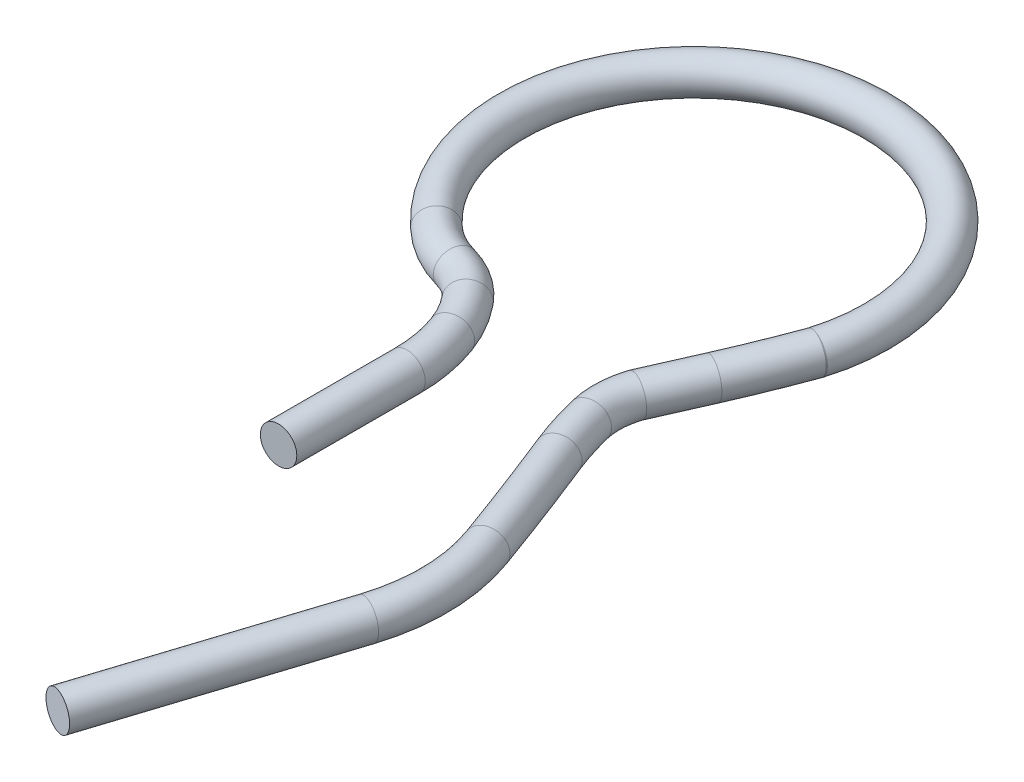
ISO-10303-21;
HEADER;
FILE_DESCRIPTION(('STEP AP214'),'2;1');
FILE_NAME('part.step','',(''),(''),'','','');
FILE_SCHEMA(('AUTOMOTIVE_DESIGN { 1 0 10303 214 1 1 1 1 }'));
ENDSEC;
DATA;
#1=APPLICATION_CONTEXT('core data for automotive mechanical design processes');
#2=APPLICATION_PROTOCOL_DEFINITION('international standard','automotive_design',2000,#1);
#3=PRODUCT_CONTEXT('',#1,'mechanical');
#4=PRODUCT('Part','Part','',(#3));
#5=PRODUCT_RELATED_PRODUCT_CATEGORY('part','',(#4));
#6=PRODUCT_DEFINITION_FORMATION('','',#4);
#7=PRODUCT_DEFINITION_CONTEXT('part definition',#1,'design');
#8=PRODUCT_DEFINITION('design','',#6,#7);
#9=PRODUCT_DEFINITION_SHAPE('','',#8);
#10=(LENGTH_UNIT() NAMED_UNIT(*) SI_UNIT(.MILLI.,.METRE.));
#11=(NAMED_UNIT(*) PLANE_ANGLE_UNIT() SI_UNIT($,.RADIAN.));
#12=(NAMED_UNIT(*) SI_UNIT($,.STERADIAN.) SOLID_ANGLE_UNIT());
#13=UNCERTAINTY_MEASURE_WITH_UNIT(LENGTH_MEASURE(1.E-05),#10,'distance_accuracy_value','');
#14=(GEOMETRIC_REPRESENTATION_CONTEXT(3) GLOBAL_UNCERTAINTY_ASSIGNED_CONTEXT((#13)) GLOBAL_UNIT_ASSIGNED_CONTEXT((#10,
#11,#12)) REPRESENTATION_CONTEXT('',''));
#15=CARTESIAN_POINT('',(0.,0.,0.));
#16=DIRECTION('',(0.,0.,1.));
#17=DIRECTION('',(1.,0.,0.));
#18=AXIS2_PLACEMENT_3D('',#15,#16,#17);
#19=CARTESIAN_POINT('',(1.30965941968045,0.,4.01059063150241));
#20=DIRECTION('',(0.305718727422765,0.,-0.952121872295246));
#21=DIRECTION('',(0.,-1.,0.));
#22=AXIS2_PLACEMENT_3D('',#19,#20,#21);
#23=PLANE('',#22);
#24=CARTESIAN_POINT('',(1.30965941968045,0.,4.01059063150241));
#25=DIRECTION('',(-0.305718727422766,0.,0.952121872295246));
#26=DIRECTION('',(0.884022965308167,0.371390676354104,0.283852712379142));
#27=AXIS2_PLACEMENT_3D('',#24,#25,#26);
#28=CIRCLE('',#27,0.2);
#29=CARTESIAN_POINT('',(1.13285482661882,-0.0742781352708209,3.95382008902658));
#30=VERTEX_POINT('',#29);
#31=EDGE_CURVE('E11',#30,#30,#28,.T.);
#32=ORIENTED_EDGE('',*,*,#31,.T.);
#33=EDGE_LOOP('',(#32));
#34=FACE_BOUND('',#33,.T.);
#35=ADVANCED_FACE('F16',(#34),#23,.F.);
#36=CARTESIAN_POINT('',(1.30965941968045,0.,4.01059063150241));
#37=DIRECTION('',(0.305718727422765,0.,-0.952121872295246));
#38=DIRECTION('',(0.884022965308168,0.371390676354104,0.283852712379141));
#39=AXIS2_PLACEMENT_3D('',#36,#37,#38);
#40=CYLINDRICAL_SURFACE('',#39,0.2);
#41=CARTESIAN_POINT('',(2.13283226718062,0.,1.44692408941113));
#42=DIRECTION('',(0.305718727422766,0.,-0.952121872295246));
#43=DIRECTION('',(0.884022965308167,0.371390676354104,0.283852712379142));
#44=AXIS2_PLACEMENT_3D('',#41,#42,#43);
#45=CIRCLE('',#44,0.2);
#46=CARTESIAN_POINT('',(1.95602767411898,-0.0742781352708209,1.3901535469353));
#47=VERTEX_POINT('',#46);
#48=CARTESIAN_POINT('',(1.94240789272157,0.,1.38578034392658));
#49=VERTEX_POINT('',#48);
#50=EDGE_CURVE('E246',#47,#49,#45,.T.);
#51=ORIENTED_EDGE('',*,*,#50,.F.);
#52=DIRECTION('',(-0.305718727422765,0.,0.952121872295246));
#53=VECTOR('',#52,1.);
#54=CARTESIAN_POINT('',(1.13285482661882,-0.0742781352708209,3.95382008902658));
#55=LINE('',#54,#53);
#56=EDGE_CURVE('E27',#47,#30,#55,.T.);
#57=ORIENTED_EDGE('',*,*,#56,.T.);
#58=ORIENTED_EDGE('',*,*,#31,.F.);
#59=ORIENTED_EDGE('',*,*,#56,.F.);
#60=CARTESIAN_POINT('',(2.13283226718062,0.,1.44692408941113));
#61=DIRECTION('',(0.305718727422766,0.,-0.952121872295246));
#62=DIRECTION('',(0.884022965308167,0.371390676354104,0.283852712379142));
#63=AXIS2_PLACEMENT_3D('',#60,#61,#62);
#64=CIRCLE('',#63,0.2);
#65=EDGE_CURVE('E249',#49,#47,#64,.T.);
#66=ORIENTED_EDGE('',*,*,#65,.F.);
#67=EDGE_LOOP('',(#51,#57,#58,#59,#66));
#68=FACE_BOUND('',#67,.T.);
#69=ADVANCED_FACE('F354',(#68),#40,.T.);
#70=CARTESIAN_POINT('',(0.157245129542019,0.,0.812578840965495));
#71=DIRECTION('',(0.,1.,0.));
#72=DIRECTION('',(0.,0.,1.));
#73=AXIS2_PLACEMENT_3D('',#70,#71,#72);
#74=TOROIDAL_SURFACE('',#73,2.07493094647235,0.2);
#75=CARTESIAN_POINT('',(2.10918879830685,0.,0.108835743949608));
#76=DIRECTION('',(-0.339164586760027,0.,-0.940727050258416));
#77=DIRECTION('',(0.873443138650185,0.371390676354104,-0.314906413180416));
#78=AXIS2_PLACEMENT_3D('',#75,#76,#77);
#79=CIRCLE('',#78,0.2);
#80=CARTESIAN_POINT('',(1.92104338825517,0.,0.17666866130161));
#81=VERTEX_POINT('',#80);
#82=EDGE_CURVE('E181',#81,#81,#79,.T.);
#83=ORIENTED_EDGE('',*,*,#82,.F.);
#84=CARTESIAN_POINT('',(0.157245129542019,0.,0.812578840965495));
#85=DIRECTION('',(0.,-1.,0.));
#86=DIRECTION('',(0.,0.,1.));
#87=AXIS2_PLACEMENT_3D('',#84,#85,#86);
#88=CIRCLE('',#87,1.87493094647234);
#89=EDGE_CURVE('E202',#81,#49,#88,.T.);
#90=ORIENTED_EDGE('',*,*,#89,.T.);
#91=ORIENTED_EDGE('',*,*,#65,.T.);
#92=ORIENTED_EDGE('',*,*,#50,.T.);
#93=ORIENTED_EDGE('',*,*,#89,.F.);
#94=EDGE_LOOP('',(#83,#90,#91,#92,#93));
#95=FACE_BOUND('',#94,.T.);
#96=ADVANCED_FACE('F358',(#95),#74,.T.);
#97=CARTESIAN_POINT('',(-33.9304438313259,0.,13.1023678258164));
#98=DIRECTION('',(0.,1.,0.));
#99=DIRECTION('',(0.,0.,1.));
#100=AXIS2_PLACEMENT_3D('',#97,#98,#99);
#101=TOROIDAL_SURFACE('',#100,38.3104032351709,0.2);
#102=CARTESIAN_POINT('',(1.62576644794548,0.,-1.16097352947715));
#103=DIRECTION('',(-0.372309872797137,0.,-0.928108484293609));
#104=DIRECTION('',(0.861727094279463,0.371390676354104,-0.345681038678597));
#105=AXIS2_PLACEMENT_3D('',#102,#103,#104);
#106=CIRCLE('',#105,0.2);
#107=CARTESIAN_POINT('',(1.81138814480421,0.,-1.23543550403657));
#108=VERTEX_POINT('',#107);
#109=CARTESIAN_POINT('',(1.44014475108676,0.,-1.08651155491772));
#110=VERTEX_POINT('',#109);
#111=EDGE_CURVE('E214',#108,#110,#106,.T.);
#112=ORIENTED_EDGE('',*,*,#111,.F.);
#113=CARTESIAN_POINT('',(1.62576644794548,0.,-1.16097352947715));
#114=DIRECTION('',(-0.372309872797137,0.,-0.928108484293609));
#115=DIRECTION('',(0.861727094279463,0.371390676354104,-0.345681038678597));
#116=AXIS2_PLACEMENT_3D('',#113,#114,#115);
#117=CIRCLE('',#116,0.2);
#118=EDGE_CURVE('E182',#110,#108,#117,.T.);
#119=ORIENTED_EDGE('',*,*,#118,.F.);
#120=CARTESIAN_POINT('',(-33.9304438313259,0.,13.1023678258164));
#121=DIRECTION('',(0.,-1.,0.));
#122=DIRECTION('',(0.,0.,1.));
#123=AXIS2_PLACEMENT_3D('',#120,#121,#122);
#124=CIRCLE('',#123,38.1104032351708);
#125=EDGE_CURVE('E178',#110,#81,#124,.T.);
#126=ORIENTED_EDGE('',*,*,#125,.T.);
#127=ORIENTED_EDGE('',*,*,#82,.T.);
#128=ORIENTED_EDGE('',*,*,#125,.F.);
#129=EDGE_LOOP('',(#112,#119,#126,#127,#128));
#130=FACE_BOUND('',#129,.T.);
#131=ADVANCED_FACE('F361',(#130),#101,.T.);
#132=CARTESIAN_POINT('',(5.09586676948779,0.,-2.55300111156554));
#133=DIRECTION('',(0.,-1.,0.));
#134=DIRECTION('',(0.,0.,-1.));
#135=AXIS2_PLACEMENT_3D('',#132,#133,#134);
#136=TOROIDAL_SURFACE('',#135,3.73889516179083,0.2);
#137=CARTESIAN_POINT('',(1.46419556721494,0.,-1.6640121861874));
#138=DIRECTION('',(-0.237767812925813,0.,-0.971322020308649));
#139=DIRECTION('',(0.901849855200159,0.371390676354104,-0.220761872144384));
#140=AXIS2_PLACEMENT_3D('',#137,#138,#139);
#141=CIRCLE('',#140,0.2);
#142=CARTESIAN_POINT('',(1.65845997127667,0.,-1.71156574877257));
#143=VERTEX_POINT('',#142);
#144=EDGE_CURVE('E193',#143,#143,#141,.T.);
#145=ORIENTED_EDGE('',*,*,#144,.F.);
#146=CARTESIAN_POINT('',(5.09586676948779,0.,-2.55300111156554));
#147=DIRECTION('',(0.,1.,0.));
#148=DIRECTION('',(0.,0.,-1.));
#149=AXIS2_PLACEMENT_3D('',#146,#147,#148);
#150=CIRCLE('',#149,3.53889516179083);
#151=EDGE_CURVE('E197',#143,#108,#150,.T.);
#152=ORIENTED_EDGE('',*,*,#151,.T.);
#153=ORIENTED_EDGE('',*,*,#111,.T.);
#154=ORIENTED_EDGE('',*,*,#118,.T.);
#155=ORIENTED_EDGE('',*,*,#151,.F.);
#156=EDGE_LOOP('',(#145,#152,#153,#154,#155));
#157=FACE_BOUND('',#156,.T.);
#158=ADVANCED_FACE('F365',(#157),#136,.T.);
#159=CARTESIAN_POINT('',(2.32539824202658,0.,-1.87482412310918));
#160=DIRECTION('',(0.,-1.,0.));
#161=DIRECTION('',(0.,0.,-1.));
#162=AXIS2_PLACEMENT_3D('',#159,#160,#161);
#163=TOROIDAL_SURFACE('',#162,0.88662941517379,0.2);
#164=CARTESIAN_POINT('',(1.48400451257575,0.,-2.15441008822946));
#165=DIRECTION('',(0.315335765242673,0.,-0.948980165840582));
#166=DIRECTION('',(0.881105964095408,0.371390676354104,0.292781907830288));
#167=AXIS2_PLACEMENT_3D('',#164,#165,#166);
#168=CIRCLE('',#167,0.2);
#169=CARTESIAN_POINT('',(1.48400451257358,-0.2,-2.15441008823041));
#170=VERTEX_POINT('',#169);
#171=CARTESIAN_POINT('',(1.48400451257356,0.2,-2.15441008823042));
#172=VERTEX_POINT('',#171);
#173=EDGE_CURVE('E192',#170,#172,#168,.T.);
#174=ORIENTED_EDGE('',*,*,#173,.F.);
#175=CARTESIAN_POINT('',(1.48400451257583,-0.2,-2.15441008822967));
#176=CARTESIAN_POINT('',(1.48578060862131,-0.2,-2.15372561519913));
#177=CARTESIAN_POINT('',(1.48755666695329,-0.19997288740284,-2.1530413111413));
#178=CARTESIAN_POINT('',(1.51174878811144,-0.199234151677348,-2.14372236191363));
#179=CARTESIAN_POINT('',(1.53387871823993,-0.194235019761009,-2.13522343845121));
#180=CARTESIAN_POINT('',(1.57712366284935,-0.175350305505054,-2.11866411728117));
#181=CARTESIAN_POINT('',(1.59760395618544,-0.160955834098276,-2.11085087072473));
#182=CARTESIAN_POINT('',(1.63222914072119,-0.124663063252035,-2.09767475281949));
#183=CARTESIAN_POINT('',(1.64606987307445,-0.103133403968921,-2.09242656311147));
#184=CARTESIAN_POINT('',(1.66533472819364,-0.0555602976679364,-2.08513007083159));
#185=CARTESIAN_POINT('',(1.67055030321535,-0.0299591563426975,-2.08315981224146));
#186=CARTESIAN_POINT('',(1.67106254610195,-0.00267092483889818,-2.08296616940297));
#187=CARTESIAN_POINT('',(1.67107507019446,-0.00133516576757789,-2.08296143496233));
#188=CARTESIAN_POINT('',(1.67107507019446,0.,-2.08296143496233));
#189=(BOUNDED_CURVE() B_SPLINE_CURVE(3,(#175,#176,#177,#178,#179,#180,#181,#182,#183,#184,#185,
#186,#187,#188),.UNSPECIFIED.,.F.,.F.) B_SPLINE_CURVE_WITH_KNOTS((4,2,2,2,2,2,4),
(-0.0624920304351753,-0.0619210025117415,-0.054711384675478,-0.046917996652376,
-0.0391523803137643,-0.0313648149590902,-0.0309638682380761),
.UNSPECIFIED.) CURVE() GEOMETRIC_REPRESENTATION_ITEM() RATIONAL_B_SPLINE_CURVE((1.,1.,1.,1.,1.,
1.,1.,1.,1.,1.,1.,1.,1.,1.)) REPRESENTATION_ITEM(''));
#190=CARTESIAN_POINT('',(1.67107507019446,0.,-2.08296143496233));
#191=VERTEX_POINT('',#190);
#192=EDGE_CURVE('E226',#170,#191,#189,.T.);
#193=ORIENTED_EDGE('',*,*,#192,.T.);
#194=CARTESIAN_POINT('',(2.32539824202658,0.,-1.87482412310918));
#195=DIRECTION('',(0.,1.,0.));
#196=DIRECTION('',(0.,0.,-1.));
#197=AXIS2_PLACEMENT_3D('',#194,#195,#196);
#198=CIRCLE('',#197,0.68662941517379);
#199=EDGE_CURVE('E198',#191,#143,#198,.T.);
#200=ORIENTED_EDGE('',*,*,#199,.T.);
#201=ORIENTED_EDGE('',*,*,#144,.T.);
#202=ORIENTED_EDGE('',*,*,#199,.F.);
#203=CARTESIAN_POINT('',(1.67107507019446,0.,-2.08296143496233));
#204=CARTESIAN_POINT('',(1.67107507019446,0.0247716265666682,-2.08296143496233));
#205=CARTESIAN_POINT('',(1.66676342446373,0.0493390249155255,-2.08459015269103));
#206=CARTESIAN_POINT('',(1.64946428898982,0.096870265843045,-2.09114001327555));
#207=CARTESIAN_POINT('',(1.63616981135731,0.119186991541913,-2.09617864318306));
#208=CARTESIAN_POINT('',(1.6023470496525,0.157028937007749,-2.10904328177535));
#209=CARTESIAN_POINT('',(1.5821608687692,0.172205322085025,-2.1167400934564));
#210=CARTESIAN_POINT('',(1.53758664489708,0.193362839445929,-2.13379979763965));
#211=CARTESIAN_POINT('',(1.51363686866358,0.199176496850499,-2.14299506203414));
#212=CARTESIAN_POINT('',(1.48755666695328,0.19997288740284,-2.1530413111413));
#213=CARTESIAN_POINT('',(1.4857806086213,0.2,-2.15372561519913));
#214=CARTESIAN_POINT('',(1.48400451257582,0.2,-2.15441008822967));
#215=(BOUNDED_CURVE() B_SPLINE_CURVE(3,(#203,#204,#205,#206,#207,#208,#209,#210,#211,#212,#213,
#214),.UNSPECIFIED.,.F.,.F.) B_SPLINE_CURVE_WITH_KNOTS((4,2,2,2,2,4),(-0.0309638682380761,
-0.0235250148108294,-0.0156621074020902,-0.00781684788490953,0.,0.000571027008389071),
.UNSPECIFIED.) CURVE() GEOMETRIC_REPRESENTATION_ITEM() RATIONAL_B_SPLINE_CURVE((1.,1.,1.,1.,1.,
1.,1.,1.,1.,1.,1.,1.)) REPRESENTATION_ITEM(''));
#216=EDGE_CURVE('E191',#191,#172,#215,.T.);
#217=ORIENTED_EDGE('',*,*,#216,.T.);
#218=EDGE_LOOP('',(#174,#193,#200,#201,#202,#217));
#219=FACE_BOUND('',#218,.T.);
#220=ADVANCED_FACE('F18',(#219),#163,.T.);
#221=CARTESIAN_POINT('',(1.48400451257572,0.,-2.15441008822947));
#222=DIRECTION('',(0.403071104005435,0.,-0.915168664845907));
#223=DIRECTION('',(0.849712773538008,0.371390676354104,0.374242124838434));
#224=AXIS2_PLACEMENT_3D('',#221,#222,#223);
#225=CYLINDRICAL_SURFACE('',#224,0.2);
#226=CARTESIAN_POINT('',(1.7400986812075,0.,-2.7358691808128));
#227=DIRECTION('',(0.403071104005439,0.,-0.915168664845905));
#228=DIRECTION('',(0.849712773538007,0.371390676354103,0.374242124838439));
#229=AXIS2_PLACEMENT_3D('',#226,#227,#228);
#230=CIRCLE('',#229,0.2);
#231=CARTESIAN_POINT('',(1.5701561264999,-0.074278135270821,-2.81071760578049));
#232=VERTEX_POINT('',#231);
#233=CARTESIAN_POINT('',(1.55706494823832,0.,-2.81648340161389));
#234=VERTEX_POINT('',#233);
#235=EDGE_CURVE('E307',#232,#234,#230,.T.);
#236=ORIENTED_EDGE('',*,*,#235,.F.);
#237=DIRECTION('',(-0.403071104005435,0.,0.915168664845907));
#238=VECTOR('',#237,1.);
#239=CARTESIAN_POINT('',(1.31406195786812,-0.0742781352708209,-2.22925851319715));
#240=LINE('',#239,#238);
#241=CARTESIAN_POINT('',(1.3105392499104,-0.0742781352708209,-2.22126024215695));
#242=VERTEX_POINT('',#241);
#243=EDGE_CURVE('E188',#232,#242,#240,.T.);
#244=ORIENTED_EDGE('',*,*,#243,.T.);
#245=CARTESIAN_POINT('',(1.48400451257581,0.,-2.15441008822966));
#246=DIRECTION('',(-0.359601045390018,0.,0.933106150528656));
#247=DIRECTION('',(0.933106150528656,0.,0.359601045390018));
#248=AXIS2_PLACEMENT_3D('',#245,#246,#247);
#249=ELLIPSE('',#248,0.200221384723887,0.2);
#250=EDGE_CURVE('E323',#172,#242,#249,.T.);
#251=ORIENTED_EDGE('',*,*,#250,.F.);
#252=ORIENTED_EDGE('',*,*,#216,.F.);
#253=ORIENTED_EDGE('',*,*,#192,.F.);
#254=CARTESIAN_POINT('',(1.48400451257581,0.,-2.15441008822966));
#255=DIRECTION('',(-0.359601045390018,0.,0.933106150528656));
#256=DIRECTION('',(0.933106150528656,0.,0.359601045390018));
#257=AXIS2_PLACEMENT_3D('',#254,#255,#256);
#258=ELLIPSE('',#257,0.200221384723887,0.2);
#259=EDGE_CURVE('E328',#242,#170,#258,.T.);
#260=ORIENTED_EDGE('',*,*,#259,.F.);
#261=ORIENTED_EDGE('',*,*,#243,.F.);
#262=CARTESIAN_POINT('',(1.7400986812075,0.,-2.7358691808128));
#263=DIRECTION('',(0.403071104005439,0.,-0.915168664845905));
#264=DIRECTION('',(0.849712773538007,0.371390676354103,0.374242124838439));
#265=AXIS2_PLACEMENT_3D('',#262,#263,#264);
#266=CIRCLE('',#265,0.2);
#267=EDGE_CURVE('E304',#234,#232,#266,.T.);
#268=ORIENTED_EDGE('',*,*,#267,.F.);
#269=EDGE_LOOP('',(#236,#244,#251,#252,#253,#260,#261,#268));
#270=FACE_BOUND('',#269,.T.);
#271=ADVANCED_FACE('F373',(#270),#225,.T.);
#272=CARTESIAN_POINT('',(1.48400451257588,0.,-2.15441008822987));
#273=DIRECTION('',(-0.315335765242668,0.,0.948980165840583));
#274=DIRECTION('',(-0.948980165840583,0.,-0.315335765242668));
#275=AXIS2_PLACEMENT_3D('',#272,#273,#274);
#276=CYLINDRICAL_SURFACE('',#275,0.2);
#277=ORIENTED_EDGE('',*,*,#250,.T.);
#278=ORIENTED_EDGE('',*,*,#259,.T.);
#279=ORIENTED_EDGE('',*,*,#173,.T.);
#280=EDGE_LOOP('',(#277,#278,#279));
#281=FACE_BOUND('',#280,.T.);
#282=ADVANCED_FACE('F375',(#281),#276,.T.);
#283=CARTESIAN_POINT('',(-10.8133379312037,0.,-8.26482548011862));
#284=DIRECTION('',(0.,1.,0.));
#285=DIRECTION('',(0.,0.,1.));
#286=AXIS2_PLACEMENT_3D('',#283,#284,#285);
#287=TOROIDAL_SURFACE('',#286,13.7170743433671,0.2);
#288=CARTESIAN_POINT('',(1.88762649799699,-0.0742781352708214,-3.59752215268466));
#289=CARTESIAN_POINT('',(1.89662518851102,-0.0979936211154166,-3.59450772619743));
#290=CARTESIAN_POINT('',(1.90985162941434,-0.119676655828388,-3.59007617969019));
#291=CARTESIAN_POINT('',(1.94366042269539,-0.156989573799479,-3.57874027745958));
#292=CARTESIAN_POINT('',(1.96405644645199,-0.172130692360627,-3.57189808649769));
#293=CARTESIAN_POINT('',(2.00920122163197,-0.193315406566222,-3.55674076044501));
#294=CARTESIAN_POINT('',(2.03351936771885,-0.199155704714732,-3.5485700992456));
#295=CARTESIAN_POINT('',(2.06005363729947,-0.199971673990641,-3.53964770411635));
#296=CARTESIAN_POINT('',(2.06189626597653,-0.2,-3.53902806797721));
#297=CARTESIAN_POINT('',(2.0637389816742,-0.2,-3.53840836762354));
#298=(BOUNDED_CURVE() B_SPLINE_CURVE(3,(#288,#289,#290,#291,#292,#293,#294,#295,#296,#297),
.UNSPECIFIED.,.F.,.F.) B_SPLINE_CURVE_WITH_KNOTS((4,2,2,2,4),(0.0385666489643795,
0.0462326410372901,0.0540503482694041,0.0618689416419568,0.0624521795358298),
.UNSPECIFIED.) CURVE() GEOMETRIC_REPRESENTATION_ITEM() RATIONAL_B_SPLINE_CURVE((1.,1.,1.,1.,1.,
1.,1.,1.,1.,1.)) REPRESENTATION_ITEM(''));
#299=CARTESIAN_POINT('',(1.88762649799698,-0.0742781352708209,-3.59752215268463));
#300=VERTEX_POINT('',#299);
#301=CARTESIAN_POINT('',(2.06373898167526,-0.2,-3.53840836762292));
#302=VERTEX_POINT('',#301);
#303=EDGE_CURVE('E218',#300,#302,#298,.T.);
#304=ORIENTED_EDGE('',*,*,#303,.T.);
#305=CARTESIAN_POINT('',(2.0637389816741,0.,-3.53840836762327));
#306=DIRECTION('',(0.344564518218905,0.,-0.938762639214287));
#307=DIRECTION('',(0.871619228784394,0.371390676354104,0.319920123672363));
#308=AXIS2_PLACEMENT_3D('',#305,#306,#307);
#309=CIRCLE('',#308,0.2);
#310=CARTESIAN_POINT('',(2.0637389816742,0.2,-3.53840836762324));
#311=VERTEX_POINT('',#310);
#312=EDGE_CURVE('E261',#311,#302,#309,.T.);
#313=ORIENTED_EDGE('',*,*,#312,.F.);
#314=CARTESIAN_POINT('',(2.06373898167418,0.2,-3.53840836762347));
#315=CARTESIAN_POINT('',(2.06189626597651,0.2,-3.53902806797714));
#316=CARTESIAN_POINT('',(2.06005363729947,0.199971673990641,-3.53964770411635));
#317=CARTESIAN_POINT('',(2.03556435013695,0.199218591044347,-3.54788245487274));
#318=CARTESIAN_POINT('',(2.01321529853549,0.194247419938238,-3.55539205877992));
#319=CARTESIAN_POINT('',(1.96935444459304,0.175418431173728,-3.57012011263814));
#320=CARTESIAN_POINT('',(1.94851603681665,0.160982690786394,-3.57711155592581));
#321=CARTESIAN_POINT('',(1.9132641751719,0.124507153906705,-3.58893248885251));
#322=CARTESIAN_POINT('',(1.89918464742631,0.102819105693781,-3.5936501894133));
#323=CARTESIAN_POINT('',(1.87970161468167,0.054975787609703,-3.600176999551));
#324=CARTESIAN_POINT('',(1.87448316040991,0.0292793264044363,-3.60192427233244));
#325=CARTESIAN_POINT('',(1.87406506240872,0.00216681227806234,-3.60206428275247));
#326=CARTESIAN_POINT('',(1.87405671429338,0.00108320895490661,-3.60206707832204));
#327=CARTESIAN_POINT('',(1.87405671429338,0.,-3.60206707832204));
#328=(BOUNDED_CURVE() B_SPLINE_CURVE(3,(#314,#315,#316,#317,#318,#319,#320,#321,#322,#323,#324,
#325,#326,#327),.UNSPECIFIED.,.F.,.F.) B_SPLINE_CURVE_WITH_KNOTS((4,2,2,2,2,2,4),
(-0.000583238090637664,0.,0.00717107100627604,0.0149856822386368,0.0227968170475222,
0.03060655745765,0.0309317733179546),
.UNSPECIFIED.) CURVE() GEOMETRIC_REPRESENTATION_ITEM() RATIONAL_B_SPLINE_CURVE((1.,1.,1.,1.,1.,
1.,1.,1.,1.,1.,1.,1.,1.,1.)) REPRESENTATION_ITEM(''));
#329=CARTESIAN_POINT('',(1.87405671429338,0.,-3.60206707832204));
#330=VERTEX_POINT('',#329);
#331=EDGE_CURVE('E225',#311,#330,#328,.T.);
#332=ORIENTED_EDGE('',*,*,#331,.T.);
#333=CARTESIAN_POINT('',(-10.8133379312037,0.,-8.26482548011862));
#334=DIRECTION('',(0.,-1.,0.));
#335=DIRECTION('',(0.,0.,1.));
#336=AXIS2_PLACEMENT_3D('',#333,#334,#335);
#337=CIRCLE('',#336,13.5170743433671);
#338=EDGE_CURVE('E272',#330,#234,#337,.T.);
#339=ORIENTED_EDGE('',*,*,#338,.T.);
#340=ORIENTED_EDGE('',*,*,#267,.T.);
#341=ORIENTED_EDGE('',*,*,#235,.T.);
#342=ORIENTED_EDGE('',*,*,#338,.F.);
#343=CARTESIAN_POINT('',(1.87405671429338,0.,-3.60206707832204));
#344=CARTESIAN_POINT('',(1.87405671429338,-0.0249343262825832,-3.60206707832204));
#345=CARTESIAN_POINT('',(1.87848037624718,-0.0496596879583786,-3.60058592908113));
#346=CARTESIAN_POINT('',(1.88727887078939,-0.0733570252991684,-3.59763860222021));
#347=CARTESIAN_POINT('',(1.88745188851296,-0.0738179629001431,-3.59758064424548));
#348=CARTESIAN_POINT('',(1.88762649799699,-0.0742781352708214,-3.59752215268466));
#349=(BOUNDED_CURVE() B_SPLINE_CURVE(3,(#343,#344,#345,#346,#347,#348),.UNSPECIFIED.,.F.,
.F.) B_SPLINE_CURVE_WITH_KNOTS((4,2,4),(0.0309317733179546,0.0384178989969992,
0.0385666489643795),
.UNSPECIFIED.) CURVE() GEOMETRIC_REPRESENTATION_ITEM() RATIONAL_B_SPLINE_CURVE((1.,1.,1.,1.,1.,1.)) REPRESENTATION_ITEM(''));
#350=EDGE_CURVE('E224',#330,#300,#349,.T.);
#351=ORIENTED_EDGE('',*,*,#350,.T.);
#352=EDGE_LOOP('',(#304,#313,#332,#339,#340,#341,#342,#351));
#353=FACE_BOUND('',#352,.T.);
#354=ADVANCED_FACE('F378',(#353),#287,.T.);
#355=CARTESIAN_POINT('',(0.151334703145003,0.,-4.12382249168385));
#356=DIRECTION('',(0.,1.,0.));
#357=DIRECTION('',(-0.260024312854714,0.,-0.965602069552688));
#358=AXIS2_PLACEMENT_3D('',#355,#356,#357);
#359=TOROIDAL_SURFACE('',#358,1.99999995529652,0.2);
#360=CARTESIAN_POINT('',(-1.2084925851551,0.,-2.6572381718507));
#361=DIRECTION('',(0.733292176306993,0.,0.67991365934724));
#362=DIRECTION('',(-0.631283984518413,0.371390676354104,0.680844693309567));
#363=AXIS2_PLACEMENT_3D('',#360,#361,#362);
#364=CIRCLE('',#363,0.2);
#365=CARTESIAN_POINT('',(-1.20849258515007,-0.2,-2.65723817185593));
#366=VERTEX_POINT('',#365);
#367=CARTESIAN_POINT('',(-1.07250985328565,0.,-2.8038966071121));
#368=VERTEX_POINT('',#367);
#369=EDGE_CURVE('E290',#366,#368,#364,.T.);
#370=ORIENTED_EDGE('',*,*,#369,.F.);
#371=CARTESIAN_POINT('',(-1.20849258515501,-0.2,-2.65723817185061));
#372=CARTESIAN_POINT('',(-1.20982795522009,-0.2,-2.65582508289032));
#373=CARTESIAN_POINT('',(-1.21116324721735,-0.199971652297517,-2.65441206229157));
#374=CARTESIAN_POINT('',(-1.22889743965704,-0.19921850847489,-2.63564535899757));
#375=CARTESIAN_POINT('',(-1.24507826235712,-0.194250394049872,-2.61852029531191));
#376=CARTESIAN_POINT('',(-1.27683861286336,-0.175429576621714,-2.58490335426683));
#377=CARTESIAN_POINT('',(-1.29192850449166,-0.160995258255688,-2.5689294675239));
#378=CARTESIAN_POINT('',(-1.31745823184127,-0.124516632995795,-2.54190247620078));
#379=CARTESIAN_POINT('',(-1.32765415902501,-0.102821328212053,-2.5311076256669));
#380=CARTESIAN_POINT('',(-1.34176160528344,-0.0549603540583915,-2.51617115710005));
#381=CARTESIAN_POINT('',(-1.34553831458414,-0.0292523752251135,-2.51217229248692));
#382=CARTESIAN_POINT('',(-1.34611298312258,0.0228254067565599,-2.51156383003766));
#383=CARTESIAN_POINT('',(-1.34290534793275,0.0486972198903754,-2.51496015647403));
#384=CARTESIAN_POINT('',(-1.32986070409665,0.0971948639328348,-2.52877144883988));
#385=CARTESIAN_POINT('',(-1.32014818722462,0.119356798386051,-2.53905458659355));
#386=CARTESIAN_POINT('',(-1.2954350136629,0.157012187003001,-2.56521744433759));
#387=CARTESIAN_POINT('',(-1.28067041263806,0.172145262924399,-2.58084722212294));
#388=CARTESIAN_POINT('',(-1.24798634514322,0.193318316172965,-2.61544248159193));
#389=CARTESIAN_POINT('',(-1.23037923868958,0.199155578753586,-2.63407728743849));
#390=CARTESIAN_POINT('',(-1.21116324721738,0.199971652297517,-2.6544120622916));
#391=CARTESIAN_POINT('',(-1.20982795522006,0.2,-2.65582508289031));
#392=CARTESIAN_POINT('',(-1.20849258515498,0.2,-2.6572381718506));
#393=(BOUNDED_CURVE() B_SPLINE_CURVE(3,(#371,#372,#373,#374,#375,#376,#377,#378,#379,#380,#381,
#382,#383,#384,#385,#386,#387,#388,#389,#390,#391,#392),.UNSPECIFIED.,.F.,
.F.) B_SPLINE_CURVE_WITH_KNOTS((4,2,2,2,2,2,2,2,2,2,4),(-0.000583269256721037,0.,
0.00716613177605195,0.0149791149577639,0.0227918427495214,0.0306044772515492,0.0384172229839993,
0.0462302577874694,0.0540436519960924,0.0618572926892365,0.0624405619156024),
.UNSPECIFIED.) CURVE() GEOMETRIC_REPRESENTATION_ITEM() RATIONAL_B_SPLINE_CURVE((1.,1.,1.,1.,1.,
1.,1.,1.,1.,1.,1.,1.,1.,1.,1.,1.,1.,1.,1.,1.,1.,1.)) REPRESENTATION_ITEM(''));
#394=CARTESIAN_POINT('',(-1.20849258515066,0.2,-2.65723817185532));
#395=VERTEX_POINT('',#394);
#396=EDGE_CURVE('E203',#366,#395,#393,.T.);
#397=ORIENTED_EDGE('',*,*,#396,.T.);
#398=CARTESIAN_POINT('',(-1.2084925851551,0.,-2.6572381718507));
#399=DIRECTION('',(0.733292176306993,0.,0.67991365934724));
#400=DIRECTION('',(-0.631283984518413,0.371390676354104,0.680844693309567));
#401=AXIS2_PLACEMENT_3D('',#398,#399,#400);
#402=CIRCLE('',#401,0.2);
#403=EDGE_CURVE('E255',#368,#395,#402,.T.);
#404=ORIENTED_EDGE('',*,*,#403,.F.);
#405=CARTESIAN_POINT('',(0.151334703145003,0.,-4.12382249168385));
#406=DIRECTION('',(0.,-1.,0.));
#407=DIRECTION('',(-0.260024312854714,0.,-0.965602069552688));
#408=AXIS2_PLACEMENT_3D('',#405,#406,#407);
#409=CIRCLE('',#408,1.79999995529652);
#410=EDGE_CURVE('E265',#368,#330,#409,.T.);
#411=ORIENTED_EDGE('',*,*,#410,.T.);
#412=ORIENTED_EDGE('',*,*,#331,.F.);
#413=CARTESIAN_POINT('',(2.06373898167412,0.,-3.53840836762327));
#414=DIRECTION('',(-0.292707068572717,0.,0.956202160637366));
#415=DIRECTION('',(0.887811417925917,0.371390676354104,0.271771690427121));
#416=AXIS2_PLACEMENT_3D('',#413,#414,#415);
#417=CIRCLE('',#416,0.2);
#418=EDGE_CURVE('E266',#302,#311,#417,.T.);
#419=ORIENTED_EDGE('',*,*,#418,.F.);
#420=ORIENTED_EDGE('',*,*,#303,.F.);
#421=ORIENTED_EDGE('',*,*,#350,.F.);
#422=ORIENTED_EDGE('',*,*,#410,.F.);
#423=EDGE_LOOP('',(#370,#397,#404,#411,#412,#419,#420,#421,#422));
#424=FACE_BOUND('',#423,.T.);
#425=ADVANCED_FACE('F384',(#424),#359,.T.);
#426=CARTESIAN_POINT('',(2.06373898167425,0.,-3.53840836762366));
#427=DIRECTION('',(-0.3445645182189,0.,0.938762639214289));
#428=DIRECTION('',(0.871619228784396,0.371390676354104,0.319920123672358));
#429=AXIS2_PLACEMENT_3D('',#426,#427,#428);
#430=CYLINDRICAL_SURFACE('',#429,0.2);
#431=CARTESIAN_POINT('',(2.06373898167418,0.,-3.53840836762347));
#432=DIRECTION('',(-0.318755083190592,0.,0.947837115194461));
#433=DIRECTION('',(0.947837115194461,0.,0.318755083190592));
#434=AXIS2_PLACEMENT_3D('',#431,#432,#433);
#435=ELLIPSE('',#434,0.200074875326162,0.2);
#436=EDGE_CURVE('E208',#302,#311,#435,.T.);
#437=ORIENTED_EDGE('',*,*,#436,.T.);
#438=ORIENTED_EDGE('',*,*,#312,.T.);
#439=EDGE_LOOP('',(#437,#438));
#440=FACE_BOUND('',#439,.T.);
#441=ADVANCED_FACE('F389',(#440),#430,.T.);
#442=CARTESIAN_POINT('',(2.06373898167412,0.,-3.53840836762327));
#443=DIRECTION('',(-0.292707068572713,0.,0.956202160637367));
#444=DIRECTION('',(0.887811417925918,0.371390676354104,0.271771690427117));
#445=AXIS2_PLACEMENT_3D('',#442,#443,#444);
#446=CYLINDRICAL_SURFACE('',#445,0.2);
#447=ORIENTED_EDGE('',*,*,#436,.F.);
#448=ORIENTED_EDGE('',*,*,#418,.T.);
#449=EDGE_LOOP('',(#447,#448));
#450=FACE_BOUND('',#449,.T.);
#451=ADVANCED_FACE('F391',(#450),#446,.T.);
#452=CARTESIAN_POINT('',(-0.0021071331682182,0.,0.278831590593224));
#453=DIRECTION('',(-0.00100093655978195,0.,0.999999499062876));
#454=DIRECTION('',(1.66377631095872E-13,1.,0.));
#455=AXIS2_PLACEMENT_3D('',#452,#453,#454);
#456=PLANE('',#455);
#457=CARTESIAN_POINT('',(-0.0021071331682212,0.,0.278831590593229));
#458=DIRECTION('',(-0.00100093655978286,0.,0.999999499062876));
#459=DIRECTION('',(-0.928476225776816,0.371390676354103,-0.000929346264813468));
#460=AXIS2_PLACEMENT_3D('',#457,#458,#459);
#461=CIRCLE('',#460,0.2);
#462=CARTESIAN_POINT('',(0.183588111987143,-0.0742781352708209,0.279017459846193));
#463=VERTEX_POINT('',#462);
#464=EDGE_CURVE('E170',#463,#463,#461,.T.);
#465=ORIENTED_EDGE('',*,*,#464,.T.);
#466=EDGE_LOOP('',(#465));
#467=FACE_BOUND('',#466,.T.);
#468=ADVANCED_FACE('F393',(#467),#456,.T.);
#469=CARTESIAN_POINT('',(-0.405563778840912,0.,-3.49091618244122));
#470=DIRECTION('',(0.,1.,0.));
#471=DIRECTION('',(-0.897856880599625,0.,-0.44028743107192));
#472=AXIS2_PLACEMENT_3D('',#469,#470,#471);
#473=TOROIDAL_SURFACE('',#472,1.15746001803574,0.2);
#474=CARTESIAN_POINT('',(-0.715137287403946,0.,-2.37562342439638));
#475=DIRECTION('',(0.963569143353729,0.,0.267459353877481));
#476=DIRECTION('',(-0.248329775834474,0.371390676354104,0.894651489660215));
#477=AXIS2_PLACEMENT_3D('',#474,#475,#476);
#478=CIRCLE('',#477,0.2);
#479=CARTESIAN_POINT('',(-0.768629158179442,0.,-2.18290959572564));
#480=VERTEX_POINT('',#479);
#481=CARTESIAN_POINT('',(-0.66164541662845,0.,-2.56833725306713));
#482=VERTEX_POINT('',#481);
#483=EDGE_CURVE('E215',#480,#482,#478,.T.);
#484=ORIENTED_EDGE('',*,*,#483,.F.);
#485=CARTESIAN_POINT('',(-0.715137287403946,0.,-2.37562342439638));
#486=DIRECTION('',(0.963569143353729,0.,0.267459353877481));
#487=DIRECTION('',(-0.248329775834474,0.371390676354104,0.894651489660215));
#488=AXIS2_PLACEMENT_3D('',#485,#486,#487);
#489=CIRCLE('',#488,0.2);
#490=EDGE_CURVE('E95',#482,#480,#489,.T.);
#491=ORIENTED_EDGE('',*,*,#490,.F.);
#492=CARTESIAN_POINT('',(-0.405563778840912,0.,-3.49091618244122));
#493=DIRECTION('',(0.,-1.,0.));
#494=DIRECTION('',(-0.897856880599625,0.,-0.44028743107192));
#495=AXIS2_PLACEMENT_3D('',#492,#493,#494);
#496=CIRCLE('',#495,0.957460018035736);
#497=CARTESIAN_POINT('',(-1.06975279392211,0.,-2.80129118406713));
#498=VERTEX_POINT('',#497);
#499=EDGE_CURVE('E106',#482,#498,#496,.T.);
#500=ORIENTED_EDGE('',*,*,#499,.T.);
#501=CARTESIAN_POINT('',(-1.2084925851551,0.,-2.65723817185071));
#502=DIRECTION('',(-0.720265061082138,0.,-0.693698956164953));
#503=DIRECTION('',(-0.644083311290594,0.371390676354104,0.668749320473812));
#504=AXIS2_PLACEMENT_3D('',#501,#502,#503);
#505=CIRCLE('',#504,0.2);
#506=EDGE_CURVE('E242',#395,#498,#505,.T.);
#507=ORIENTED_EDGE('',*,*,#506,.F.);
#508=ORIENTED_EDGE('',*,*,#396,.F.);
#509=CARTESIAN_POINT('',(-1.2084925851551,0.,-2.65723817185071));
#510=DIRECTION('',(-0.720265061082138,0.,-0.693698956164953));
#511=DIRECTION('',(-0.644083311290594,0.371390676354104,0.668749320473812));
#512=AXIS2_PLACEMENT_3D('',#509,#510,#511);
#513=CIRCLE('',#512,0.2);
#514=EDGE_CURVE('E293',#498,#366,#513,.T.);
#515=ORIENTED_EDGE('',*,*,#514,.F.);
#516=ORIENTED_EDGE('',*,*,#499,.F.);
#517=EDGE_LOOP('',(#484,#491,#500,#507,#508,#515,#516));
#518=FACE_BOUND('',#517,.T.);
#519=ADVANCED_FACE('F400',(#518),#473,.T.);
#520=CARTESIAN_POINT('',(-1.20849258515482,0.,-2.65723817185044));
#521=DIRECTION('',(-0.733292176306996,0.,-0.679913659347237));
#522=DIRECTION('',(0.679913659347237,2.0976926792815E-12,-0.733292176306996));
#523=AXIS2_PLACEMENT_3D('',#520,#521,#522);
#524=CYLINDRICAL_SURFACE('',#523,0.2);
#525=CARTESIAN_POINT('',(-1.20849258515496,0.,-2.65723817185057));
#526=DIRECTION('',(-0.726811302329342,0.,-0.686837193814027));
#527=DIRECTION('',(-0.686837193814027,-9.61253786100351E-13,0.726811302329341));
#528=AXIS2_PLACEMENT_3D('',#525,#526,#527);
#529=ELLIPSE('',#528,0.200008994110155,0.2);
#530=EDGE_CURVE('E238',#395,#366,#529,.T.);
#531=ORIENTED_EDGE('',*,*,#530,.T.);
#532=ORIENTED_EDGE('',*,*,#369,.T.);
#533=ORIENTED_EDGE('',*,*,#403,.T.);
#534=EDGE_LOOP('',(#531,#532,#533));
#535=FACE_BOUND('',#534,.T.);
#536=ADVANCED_FACE('F418',(#535),#524,.T.);
#537=CARTESIAN_POINT('',(-1.2084925851551,0.,-2.65723817185071));
#538=DIRECTION('',(-0.720265061082142,0.,-0.693698956164948));
#539=DIRECTION('',(0.693698956164948,2.09693373776076E-12,-0.720265061082142));
#540=AXIS2_PLACEMENT_3D('',#537,#538,#539);
#541=CYLINDRICAL_SURFACE('',#540,0.2);
#542=ORIENTED_EDGE('',*,*,#530,.F.);
#543=ORIENTED_EDGE('',*,*,#506,.T.);
#544=ORIENTED_EDGE('',*,*,#514,.T.);
#545=EDGE_LOOP('',(#542,#543,#544));
#546=FACE_BOUND('',#545,.T.);
#547=ADVANCED_FACE('F422',(#546),#541,.T.);
#548=CARTESIAN_POINT('',(-0.913867829379705,0.,-1.65966185747465));
#549=DIRECTION('',(0.,-1.,0.));
#550=DIRECTION('',(0.,0.,-1.));
#551=AXIS2_PLACEMENT_3D('',#548,#549,#550);
#552=TOROIDAL_SURFACE('',#551,0.743030816065531,0.2);
#553=CARTESIAN_POINT('',(-0.340475677669248,0.,-2.13222532832259));
#554=DIRECTION('',(0.635994444147149,0.,0.771693635462908));
#555=DIRECTION('',(-0.716499553031816,0.371390676354104,0.590506016923155));
#556=AXIS2_PLACEMENT_3D('',#553,#554,#555);
#557=CIRCLE('',#556,0.2);
#558=CARTESIAN_POINT('',(-0.49481440476183,0.,-2.00502643949316));
#559=VERTEX_POINT('',#558);
#560=EDGE_CURVE('E183',#559,#559,#557,.T.);
#561=ORIENTED_EDGE('',*,*,#560,.F.);
#562=CARTESIAN_POINT('',(-0.913867829379705,0.,-1.65966185747465));
#563=DIRECTION('',(0.,1.,0.));
#564=DIRECTION('',(0.,0.,-1.));
#565=AXIS2_PLACEMENT_3D('',#562,#563,#564);
#566=CIRCLE('',#565,0.54303081606553);
#567=EDGE_CURVE('E187',#559,#480,#566,.T.);
#568=ORIENTED_EDGE('',*,*,#567,.T.);
#569=ORIENTED_EDGE('',*,*,#483,.T.);
#570=ORIENTED_EDGE('',*,*,#490,.T.);
#571=ORIENTED_EDGE('',*,*,#567,.F.);
#572=EDGE_LOOP('',(#561,#568,#569,#570,#571));
#573=FACE_BOUND('',#572,.T.);
#574=ADVANCED_FACE('F425',(#573),#552,.T.);
#575=CARTESIAN_POINT('',(-1.42439534444474,0.,-1.23890853226309));
#576=DIRECTION('',(0.,-1.,0.));
#577=DIRECTION('',(0.,0.,-1.));
#578=AXIS2_PLACEMENT_3D('',#575,#576,#577);
#579=TOROIDAL_SURFACE('',#578,1.4045984273609,0.2);
#580=CARTESIAN_POINT('',(-0.103538220297917,0.,-1.71664611685875));
#581=DIRECTION('',(0.340123963753186,0.,0.94038060873288));
#582=DIRECTION('',(-0.87312147576897,0.371390676354104,0.315797172356336));
#583=AXIS2_PLACEMENT_3D('',#580,#581,#582);
#584=CIRCLE('',#583,0.2);
#585=CARTESIAN_POINT('',(-0.291614342044493,0.,-1.64862132410812));
#586=VERTEX_POINT('',#585);
#587=EDGE_CURVE('E245',#586,#586,#584,.T.);
#588=ORIENTED_EDGE('',*,*,#587,.F.);
#589=CARTESIAN_POINT('',(-1.42439534444474,0.,-1.23890853226309));
#590=DIRECTION('',(0.,1.,0.));
#591=DIRECTION('',(0.,0.,-1.));
#592=AXIS2_PLACEMENT_3D('',#589,#590,#591);
#593=CIRCLE('',#592,1.2045984273609);
#594=EDGE_CURVE('E20',#586,#559,#593,.T.);
#595=ORIENTED_EDGE('',*,*,#594,.T.);
#596=ORIENTED_EDGE('',*,*,#560,.T.);
#597=ORIENTED_EDGE('',*,*,#594,.F.);
#598=EDGE_LOOP('',(#588,#595,#596,#597));
#599=FACE_BOUND('',#598,.T.);
#600=ADVANCED_FACE('F416',(#599),#579,.T.);
#601=CARTESIAN_POINT('',(-1.72564547820691,0.,-1.12995010774344));
#602=DIRECTION('',(0.,-1.,0.));
#603=DIRECTION('',(0.,0.,-1.));
#604=AXIS2_PLACEMENT_3D('',#601,#602,#603);
#605=TOROIDAL_SURFACE('',#604,1.72494758276096,0.2);
#606=CARTESIAN_POINT('',(-0.000698759536233301,0.,-1.12822354464434));
#607=DIRECTION('',(-0.00100093655978286,0.,0.999999499062876));
#608=DIRECTION('',(-0.928476225776816,0.371390676354104,-0.000929346264813469));
#609=AXIS2_PLACEMENT_3D('',#606,#607,#608);
#610=CIRCLE('',#609,0.2);
#611=CARTESIAN_POINT('',(0.18499648561913,-0.0742781352708209,-1.12803767539137));
#612=VERTEX_POINT('',#611);
#613=CARTESIAN_POINT('',(-0.200698659348809,0.,-1.12842373195629));
#614=VERTEX_POINT('',#613);
#615=EDGE_CURVE('E160',#612,#614,#610,.T.);
#616=ORIENTED_EDGE('',*,*,#615,.F.);
#617=CARTESIAN_POINT('',(-0.000698759536233301,0.,-1.12822354464434));
#618=DIRECTION('',(-0.00100093655978286,0.,0.999999499062876));
#619=DIRECTION('',(-0.928476225776816,0.371390676354104,-0.000929346264813469));
#620=AXIS2_PLACEMENT_3D('',#617,#618,#619);
#621=CIRCLE('',#620,0.2);
#622=EDGE_CURVE('E153',#614,#612,#621,.T.);
#623=ORIENTED_EDGE('',*,*,#622,.F.);
#624=CARTESIAN_POINT('',(-1.72564547820691,0.,-1.12995010774344));
#625=DIRECTION('',(0.,1.,0.));
#626=DIRECTION('',(0.,0.,-1.));
#627=AXIS2_PLACEMENT_3D('',#624,#625,#626);
#628=CIRCLE('',#627,1.52494758276095);
#629=EDGE_CURVE('E164',#614,#586,#628,.T.);
#630=ORIENTED_EDGE('',*,*,#629,.T.);
#631=ORIENTED_EDGE('',*,*,#587,.T.);
#632=ORIENTED_EDGE('',*,*,#629,.F.);
#633=EDGE_LOOP('',(#616,#623,#630,#631,#632));
#634=FACE_BOUND('',#633,.T.);
#635=ADVANCED_FACE('F166',(#634),#605,.T.);
#636=CARTESIAN_POINT('',(-0.000698759536233301,0.,-1.12822354464434));
#637=DIRECTION('',(-0.00100093655977701,0.,0.999999499062876));
#638=DIRECTION('',(-0.928476225776816,0.371390676354104,-0.000929346264807833));
#639=AXIS2_PLACEMENT_3D('',#636,#637,#638);
#640=CYLINDRICAL_SURFACE('',#639,0.2);
#641=ORIENTED_EDGE('',*,*,#464,.F.);
#642=DIRECTION('',(0.00100093655977701,0.,-0.999999499062876));
#643=VECTOR('',#642,1.);
#644=CARTESIAN_POINT('',(0.18499648561913,-0.0742781352708209,-1.12803767539137));
#645=LINE('',#644,#643);
#646=EDGE_CURVE('E158',#463,#612,#645,.T.);
#647=ORIENTED_EDGE('',*,*,#646,.T.);
#648=ORIENTED_EDGE('',*,*,#615,.T.);
#649=ORIENTED_EDGE('',*,*,#622,.T.);
#650=ORIENTED_EDGE('',*,*,#646,.F.);
#651=EDGE_LOOP('',(#641,#647,#648,#649,#650));
#652=FACE_BOUND('',#651,.T.);
#653=ADVANCED_FACE('F156',(#652),#640,.T.);
#654=CLOSED_SHELL('',(#35,#69,#96,#131,#158,#220,#271,#282,#354,#425,#441,#451,#468,#519,#536,
#547,#574,#600,#635,#653));
#655=MANIFOLD_SOLID_BREP('B1',#654);
#656=ADVANCED_BREP_SHAPE_REPRESENTATION('',(#18,#655),#14);
#657=SHAPE_DEFINITION_REPRESENTATION(#9,#656);
ENDSEC;
END-ISO-10303-21;
